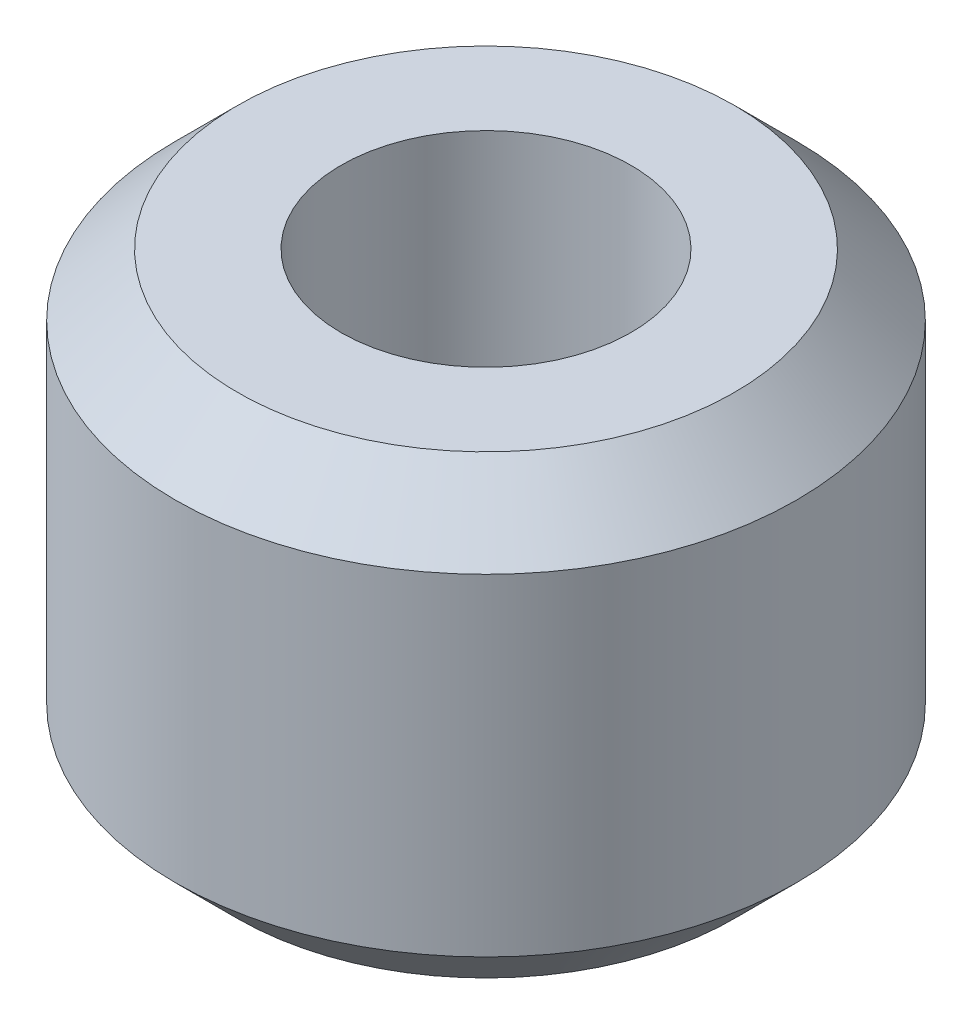
ISO-10303-21;
HEADER;
FILE_DESCRIPTION(('STEP AP214'),'2;1');
FILE_NAME('part.step','',(''),(''),'','','');
FILE_SCHEMA(('AUTOMOTIVE_DESIGN { 1 0 10303 214 1 1 1 1 }'));
ENDSEC;
DATA;
#1=APPLICATION_CONTEXT('core data for automotive mechanical design processes');
#2=APPLICATION_PROTOCOL_DEFINITION('international standard','automotive_design',2000,#1);
#3=PRODUCT_CONTEXT('',#1,'mechanical');
#4=PRODUCT('Part','Part','',(#3));
#5=PRODUCT_RELATED_PRODUCT_CATEGORY('part','',(#4));
#6=PRODUCT_DEFINITION_FORMATION('','',#4);
#7=PRODUCT_DEFINITION_CONTEXT('part definition',#1,'design');
#8=PRODUCT_DEFINITION('design','',#6,#7);
#9=PRODUCT_DEFINITION_SHAPE('','',#8);
#10=(LENGTH_UNIT() NAMED_UNIT(*) SI_UNIT(.MILLI.,.METRE.));
#11=(NAMED_UNIT(*) PLANE_ANGLE_UNIT() SI_UNIT($,.RADIAN.));
#12=(NAMED_UNIT(*) SI_UNIT($,.STERADIAN.) SOLID_ANGLE_UNIT());
#13=UNCERTAINTY_MEASURE_WITH_UNIT(LENGTH_MEASURE(1.E-05),#10,'distance_accuracy_value','');
#14=(GEOMETRIC_REPRESENTATION_CONTEXT(3) GLOBAL_UNCERTAINTY_ASSIGNED_CONTEXT((#13)) GLOBAL_UNIT_ASSIGNED_CONTEXT((#10,
#11,#12)) REPRESENTATION_CONTEXT('',''));
#15=CARTESIAN_POINT('',(0.,0.,0.));
#16=DIRECTION('',(0.,0.,1.));
#17=DIRECTION('',(1.,0.,0.));
#18=AXIS2_PLACEMENT_3D('',#15,#16,#17);
#19=CARTESIAN_POINT('',(0.,11.,0.));
#20=DIRECTION('',(0.,1.,0.));
#21=DIRECTION('',(0.,0.,1.));
#22=AXIS2_PLACEMENT_3D('',#19,#20,#21);
#23=PLANE('',#22);
#24=CARTESIAN_POINT('',(0.,11.,0.));
#25=DIRECTION('',(0.,1.,0.));
#26=DIRECTION('',(0.,0.,1.));
#27=AXIS2_PLACEMENT_3D('',#24,#25,#26);
#28=CIRCLE('',#27,6.);
#29=CARTESIAN_POINT('',(0.,11.,-6.));
#30=VERTEX_POINT('',#29);
#31=EDGE_CURVE('E49',#30,#30,#28,.T.);
#32=ORIENTED_EDGE('',*,*,#31,.T.);
#33=EDGE_LOOP('',(#32));
#34=FACE_BOUND('',#33,.T.);
#35=CARTESIAN_POINT('',(0.,11.,0.));
#36=DIRECTION('',(0.,1.,0.));
#37=DIRECTION('',(0.,0.,1.));
#38=AXIS2_PLACEMENT_3D('',#35,#36,#37);
#39=CIRCLE('',#38,3.5);
#40=CARTESIAN_POINT('',(0.,11.,3.5));
#41=VERTEX_POINT('',#40);
#42=EDGE_CURVE('E60',#41,#41,#39,.T.);
#43=ORIENTED_EDGE('',*,*,#42,.F.);
#44=EDGE_LOOP('',(#43));
#45=FACE_BOUND('',#44,.T.);
#46=ADVANCED_FACE('F33',(#34,#45),#23,.T.);
#47=CARTESIAN_POINT('',(0.,0.,0.));
#48=DIRECTION('',(0.,1.,0.));
#49=DIRECTION('',(0.,0.,1.));
#50=AXIS2_PLACEMENT_3D('',#47,#48,#49);
#51=PLANE('',#50);
#52=CARTESIAN_POINT('',(0.,0.,0.));
#53=DIRECTION('',(0.,1.,0.));
#54=DIRECTION('',(0.,0.,1.));
#55=AXIS2_PLACEMENT_3D('',#52,#53,#54);
#56=CIRCLE('',#55,6.);
#57=CARTESIAN_POINT('',(0.,0.,6.));
#58=VERTEX_POINT('',#57);
#59=EDGE_CURVE('E10',#58,#58,#56,.F.);
#60=ORIENTED_EDGE('',*,*,#59,.T.);
#61=EDGE_LOOP('',(#60));
#62=FACE_BOUND('',#61,.T.);
#63=CARTESIAN_POINT('',(0.,0.,0.));
#64=DIRECTION('',(0.,1.,0.));
#65=DIRECTION('',(0.,0.,1.));
#66=AXIS2_PLACEMENT_3D('',#63,#64,#65);
#67=CIRCLE('',#66,4.5);
#68=CARTESIAN_POINT('',(0.,0.,4.5));
#69=VERTEX_POINT('',#68);
#70=EDGE_CURVE('E57',#69,#69,#67,.T.);
#71=ORIENTED_EDGE('',*,*,#70,.T.);
#72=EDGE_LOOP('',(#71));
#73=FACE_BOUND('',#72,.T.);
#74=ADVANCED_FACE('F67',(#62,#73),#51,.F.);
#75=CARTESIAN_POINT('',(0.,11.,0.));
#76=DIRECTION('',(0.,-1.,0.));
#77=DIRECTION('',(0.,0.,-1.));
#78=AXIS2_PLACEMENT_3D('',#75,#76,#77);
#79=CYLINDRICAL_SURFACE('',#78,7.5);
#80=CARTESIAN_POINT('',(0.,9.49999999999999,0.));
#81=DIRECTION('',(0.,1.,0.));
#82=DIRECTION('',(0.,0.,1.));
#83=AXIS2_PLACEMENT_3D('',#80,#81,#82);
#84=CIRCLE('',#83,7.5);
#85=CARTESIAN_POINT('',(0.,9.49999999999999,-7.5));
#86=VERTEX_POINT('',#85);
#87=EDGE_CURVE('E41',#86,#86,#84,.F.);
#88=ORIENTED_EDGE('',*,*,#87,.T.);
#89=EDGE_LOOP('',(#88));
#90=FACE_BOUND('',#89,.T.);
#91=CARTESIAN_POINT('',(0.,1.5,0.));
#92=DIRECTION('',(0.,1.,0.));
#93=DIRECTION('',(0.,0.,1.));
#94=AXIS2_PLACEMENT_3D('',#91,#92,#93);
#95=CIRCLE('',#94,7.5);
#96=CARTESIAN_POINT('',(0.,1.5,7.5));
#97=VERTEX_POINT('',#96);
#98=EDGE_CURVE('E45',#97,#97,#95,.T.);
#99=ORIENTED_EDGE('',*,*,#98,.T.);
#100=EDGE_LOOP('',(#99));
#101=FACE_BOUND('',#100,.T.);
#102=ADVANCED_FACE('F73',(#90,#101),#79,.T.);
#103=CARTESIAN_POINT('',(0.,11.,0.));
#104=DIRECTION('',(0.,-1.,0.));
#105=DIRECTION('',(0.,0.,-1.));
#106=AXIS2_PLACEMENT_3D('',#103,#104,#105);
#107=CYLINDRICAL_SURFACE('',#106,3.5);
#108=CARTESIAN_POINT('',(0.,1.00000000000001,0.));
#109=DIRECTION('',(0.,1.,0.));
#110=DIRECTION('',(0.,0.,1.));
#111=AXIS2_PLACEMENT_3D('',#108,#109,#110);
#112=CIRCLE('',#111,3.5);
#113=CARTESIAN_POINT('',(0.,1.00000000000001,3.5));
#114=VERTEX_POINT('',#113);
#115=EDGE_CURVE('E54',#114,#114,#112,.F.);
#116=ORIENTED_EDGE('',*,*,#115,.T.);
#117=EDGE_LOOP('',(#116));
#118=FACE_BOUND('',#117,.T.);
#119=ORIENTED_EDGE('',*,*,#42,.T.);
#120=EDGE_LOOP('',(#119));
#121=FACE_BOUND('',#120,.T.);
#122=ADVANCED_FACE('F64',(#118,#121),#107,.F.);
#123=CARTESIAN_POINT('',(0.,0.,0.));
#124=DIRECTION('',(0.,-1.,0.));
#125=DIRECTION('',(0.,0.,-1.));
#126=AXIS2_PLACEMENT_3D('',#123,#124,#125);
#127=CONICAL_SURFACE('',#126,4.5,0.785398163397446);
#128=ORIENTED_EDGE('',*,*,#115,.F.);
#129=EDGE_LOOP('',(#128));
#130=FACE_BOUND('',#129,.T.);
#131=ORIENTED_EDGE('',*,*,#70,.F.);
#132=EDGE_LOOP('',(#131));
#133=FACE_BOUND('',#132,.T.);
#134=ADVANCED_FACE('F80',(#130,#133),#127,.F.);
#135=CARTESIAN_POINT('',(0.,11.,0.));
#136=DIRECTION('',(0.,-1.,0.));
#137=DIRECTION('',(0.,0.,-1.));
#138=AXIS2_PLACEMENT_3D('',#135,#136,#137);
#139=CONICAL_SURFACE('',#138,6.,0.785398163397447);
#140=CARTESIAN_POINT('',(0.,9.49999999999999,-7.5));
#141=CARTESIAN_POINT('',(0.,9.51562499999999,-7.484375));
#142=CARTESIAN_POINT('',(0.,9.53124999999999,-7.46875));
#143=CARTESIAN_POINT('',(0.,9.56249999999999,-7.4375));
#144=CARTESIAN_POINT('',(0.,9.57812499999999,-7.421875));
#145=CARTESIAN_POINT('',(0.,9.60937499999999,-7.390625));
#146=CARTESIAN_POINT('',(0.,9.62499999999999,-7.375));
#147=CARTESIAN_POINT('',(0.,9.65624999999999,-7.34375));
#148=CARTESIAN_POINT('',(0.,9.67187499999999,-7.328125));
#149=CARTESIAN_POINT('',(0.,9.70312499999999,-7.296875));
#150=CARTESIAN_POINT('',(0.,9.71874999999999,-7.28125));
#151=CARTESIAN_POINT('',(0.,9.74999999999999,-7.25));
#152=CARTESIAN_POINT('',(0.,9.76562499999999,-7.234375));
#153=CARTESIAN_POINT('',(0.,9.79687499999999,-7.203125));
#154=CARTESIAN_POINT('',(0.,9.81249999999999,-7.1875));
#155=CARTESIAN_POINT('',(0.,9.84374999999999,-7.15625));
#156=CARTESIAN_POINT('',(0.,9.85937499999999,-7.140625));
#157=CARTESIAN_POINT('',(0.,9.89062499999999,-7.109375));
#158=CARTESIAN_POINT('',(0.,9.90624999999999,-7.09375));
#159=CARTESIAN_POINT('',(0.,9.93749999999999,-7.0625));
#160=CARTESIAN_POINT('',(0.,9.95312499999999,-7.046875));
#161=CARTESIAN_POINT('',(0.,9.98437499999999,-7.015625));
#162=CARTESIAN_POINT('',(0.,9.99999999999999,-7.));
#163=CARTESIAN_POINT('',(0.,10.03125,-6.96875));
#164=CARTESIAN_POINT('',(0.,10.046875,-6.953125));
#165=CARTESIAN_POINT('',(0.,10.078125,-6.921875));
#166=CARTESIAN_POINT('',(0.,10.09375,-6.90625));
#167=CARTESIAN_POINT('',(0.,10.125,-6.875));
#168=CARTESIAN_POINT('',(0.,10.140625,-6.859375));
#169=CARTESIAN_POINT('',(0.,10.171875,-6.828125));
#170=CARTESIAN_POINT('',(0.,10.1875,-6.8125));
#171=CARTESIAN_POINT('',(0.,10.21875,-6.78125));
#172=CARTESIAN_POINT('',(0.,10.234375,-6.765625));
#173=CARTESIAN_POINT('',(0.,10.265625,-6.734375));
#174=CARTESIAN_POINT('',(0.,10.28125,-6.71875));
#175=CARTESIAN_POINT('',(0.,10.3125,-6.6875));
#176=CARTESIAN_POINT('',(0.,10.328125,-6.671875));
#177=CARTESIAN_POINT('',(0.,10.359375,-6.640625));
#178=CARTESIAN_POINT('',(0.,10.375,-6.625));
#179=CARTESIAN_POINT('',(0.,10.40625,-6.59375));
#180=CARTESIAN_POINT('',(0.,10.421875,-6.578125));
#181=CARTESIAN_POINT('',(0.,10.453125,-6.546875));
#182=CARTESIAN_POINT('',(0.,10.46875,-6.53125));
#183=CARTESIAN_POINT('',(0.,10.5,-6.5));
#184=CARTESIAN_POINT('',(0.,10.515625,-6.484375));
#185=CARTESIAN_POINT('',(0.,10.546875,-6.453125));
#186=CARTESIAN_POINT('',(0.,10.5625,-6.4375));
#187=CARTESIAN_POINT('',(0.,10.59375,-6.40625));
#188=CARTESIAN_POINT('',(0.,10.609375,-6.390625));
#189=CARTESIAN_POINT('',(0.,10.640625,-6.359375));
#190=CARTESIAN_POINT('',(0.,10.65625,-6.34375));
#191=CARTESIAN_POINT('',(0.,10.6875,-6.3125));
#192=CARTESIAN_POINT('',(0.,10.703125,-6.296875));
#193=CARTESIAN_POINT('',(0.,10.734375,-6.265625));
#194=CARTESIAN_POINT('',(0.,10.75,-6.25));
#195=CARTESIAN_POINT('',(0.,10.78125,-6.21875));
#196=CARTESIAN_POINT('',(0.,10.796875,-6.203125));
#197=CARTESIAN_POINT('',(0.,10.828125,-6.171875));
#198=CARTESIAN_POINT('',(0.,10.84375,-6.15625));
#199=CARTESIAN_POINT('',(0.,10.875,-6.125));
#200=CARTESIAN_POINT('',(0.,10.890625,-6.109375));
#201=CARTESIAN_POINT('',(0.,10.921875,-6.078125));
#202=CARTESIAN_POINT('',(0.,10.9375,-6.0625));
#203=CARTESIAN_POINT('',(0.,10.96875,-6.03125));
#204=CARTESIAN_POINT('',(0.,10.984375,-6.015625));
#205=CARTESIAN_POINT('',(0.,11.,-6.));
#206=B_SPLINE_CURVE_WITH_KNOTS('',3,(#140,#141,#142,#143,#144,#145,#146,#147,#148,#149,#150,
#151,#152,#153,#154,#155,#156,#157,#158,#159,#160,#161,#162,#163,#164,#165,#166,#167,#168,#169,
#170,#171,#172,#173,#174,#175,#176,#177,#178,#179,#180,#181,#182,#183,#184,#185,#186,#187,#188,
#189,#190,#191,#192,#193,#194,#195,#196,#197,#198,#199,#200,#201,#202,#203,#204,#205),
.UNSPECIFIED.,.F.,.F.,(4,2,2,2,2,2,2,2,2,2,2,2,2,2,2,2,2,2,2,2,2,2,2,2,2,2,2,2,2,2,2,2,4),(0.,
0.0662912607362383,0.132582521472478,0.198873782208716,0.265165042944956,0.331456303681195,
0.397747564417434,0.464038825153673,0.530330085889912,0.596621346626151,0.66291260736239,
0.729203868098629,0.795495128834868,0.861786389571106,0.928077650307345,0.994368911043584,
1.06066017177982,1.12695143251606,1.1932426932523,1.25953395398854,1.32582521472478,
1.39211647546102,1.45840773619726,1.52469899693349,1.59099025766973,1.65728151840597,
1.72357277914221,1.78986403987845,1.85615530061469,1.92244656135093,1.98873782208717,
2.05502908282341,2.12132034355964),.UNSPECIFIED.);
#207=EDGE_CURVE('BSEAM85',#86,#30,#206,.T.);
#208=ORIENTED_EDGE('',*,*,#87,.F.);
#209=ORIENTED_EDGE('',*,*,#31,.F.);
#210=ORIENTED_EDGE('',*,*,#207,.T.);
#211=ORIENTED_EDGE('',*,*,#207,.F.);
#212=EDGE_LOOP('',(#208,#210,#209,#211));
#213=FACE_BOUND('',#212,.T.);
#214=ADVANCED_FACE('F85',(#213),#139,.T.);
#215=CARTESIAN_POINT('',(0.,1.5,0.));
#216=DIRECTION('',(0.,1.,0.));
#217=DIRECTION('',(0.,0.,1.));
#218=AXIS2_PLACEMENT_3D('',#215,#216,#217);
#219=CONICAL_SURFACE('',#218,7.5,0.78539816339745);
#220=ORIENTED_EDGE('',*,*,#59,.F.);
#221=EDGE_LOOP('',(#220));
#222=FACE_BOUND('',#221,.T.);
#223=ORIENTED_EDGE('',*,*,#98,.F.);
#224=EDGE_LOOP('',(#223));
#225=FACE_BOUND('',#224,.T.);
#226=ADVANCED_FACE('F36',(#222,#225),#219,.T.);
#227=CLOSED_SHELL('',(#46,#74,#102,#122,#134,#214,#226));
#228=MANIFOLD_SOLID_BREP('B2',#227);
#229=ADVANCED_BREP_SHAPE_REPRESENTATION('',(#18,#228),#14);
#230=SHAPE_DEFINITION_REPRESENTATION(#9,#229);
ENDSEC;
END-ISO-10303-21;
